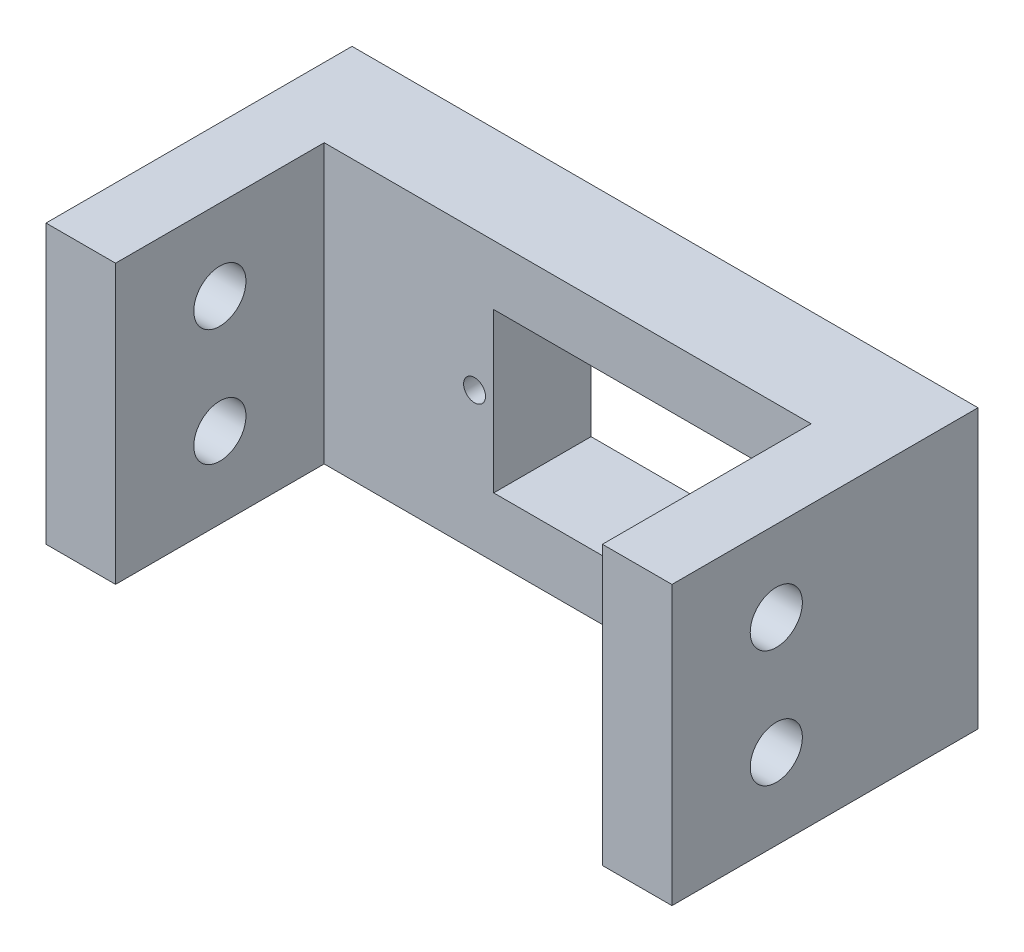
ISO-10303-21;
HEADER;
FILE_DESCRIPTION(('STEP AP214'),'2;1');
FILE_NAME('part.step','',(''),(''),'','','');
FILE_SCHEMA(('AUTOMOTIVE_DESIGN { 1 0 10303 214 1 1 1 1 }'));
ENDSEC;
DATA;
#1=APPLICATION_CONTEXT('core data for automotive mechanical design processes');
#2=APPLICATION_PROTOCOL_DEFINITION('international standard','automotive_design',2000,#1);
#3=PRODUCT_CONTEXT('',#1,'mechanical');
#4=PRODUCT('Part','Part','',(#3));
#5=PRODUCT_RELATED_PRODUCT_CATEGORY('part','',(#4));
#6=PRODUCT_DEFINITION_FORMATION('','',#4);
#7=PRODUCT_DEFINITION_CONTEXT('part definition',#1,'design');
#8=PRODUCT_DEFINITION('design','',#6,#7);
#9=PRODUCT_DEFINITION_SHAPE('','',#8);
#10=(LENGTH_UNIT() NAMED_UNIT(*) SI_UNIT(.MILLI.,.METRE.));
#11=(NAMED_UNIT(*) PLANE_ANGLE_UNIT() SI_UNIT($,.RADIAN.));
#12=(NAMED_UNIT(*) SI_UNIT($,.STERADIAN.) SOLID_ANGLE_UNIT());
#13=UNCERTAINTY_MEASURE_WITH_UNIT(LENGTH_MEASURE(1.E-05),#10,'distance_accuracy_value','');
#14=(GEOMETRIC_REPRESENTATION_CONTEXT(3) GLOBAL_UNCERTAINTY_ASSIGNED_CONTEXT((#13)) GLOBAL_UNIT_ASSIGNED_CONTEXT((#10,
#11,#12)) REPRESENTATION_CONTEXT('',''));
#15=CARTESIAN_POINT('',(0.,0.,0.));
#16=DIRECTION('',(0.,0.,1.));
#17=DIRECTION('',(1.,0.,0.));
#18=AXIS2_PLACEMENT_3D('',#15,#16,#17);
#19=CARTESIAN_POINT('',(28.575,25.4,-8.88999999999999));
#20=DIRECTION('',(-1.,0.,0.));
#21=DIRECTION('',(0.,0.,1.));
#22=AXIS2_PLACEMENT_3D('',#19,#20,#21);
#23=PLANE('',#22);
#24=CARTESIAN_POINT('',(28.575,18.034,9.525));
#25=DIRECTION('',(-1.,0.,0.));
#26=DIRECTION('',(0.,0.,1.));
#27=AXIS2_PLACEMENT_3D('',#24,#25,#26);
#28=CIRCLE('',#27,2.38125000000001);
#29=CARTESIAN_POINT('',(28.575,18.034,11.90625));
#30=VERTEX_POINT('',#29);
#31=EDGE_CURVE('E155',#30,#30,#28,.T.);
#32=ORIENTED_EDGE('',*,*,#31,.T.);
#33=EDGE_LOOP('',(#32));
#34=FACE_BOUND('',#33,.T.);
#35=CARTESIAN_POINT('',(28.575,7.366,9.525));
#36=DIRECTION('',(-1.,0.,0.));
#37=DIRECTION('',(0.,0.,-1.));
#38=AXIS2_PLACEMENT_3D('',#35,#36,#37);
#39=CIRCLE('',#38,2.38125);
#40=CARTESIAN_POINT('',(28.575,7.366,7.14375));
#41=VERTEX_POINT('',#40);
#42=EDGE_CURVE('E156',#41,#41,#39,.T.);
#43=ORIENTED_EDGE('',*,*,#42,.T.);
#44=EDGE_LOOP('',(#43));
#45=FACE_BOUND('',#44,.T.);
#46=DIRECTION('',(0.,0.,-1.));
#47=VECTOR('',#46,1.);
#48=CARTESIAN_POINT('',(28.575,0.,-8.88999999999999));
#49=LINE('',#48,#47);
#50=CARTESIAN_POINT('',(28.575,0.,19.05));
#51=VERTEX_POINT('',#50);
#52=CARTESIAN_POINT('',(28.575,0.,-8.88999999999999));
#53=VERTEX_POINT('',#52);
#54=EDGE_CURVE('E172',#51,#53,#49,.T.);
#55=ORIENTED_EDGE('',*,*,#54,.T.);
#56=DIRECTION('',(0.,-1.,0.));
#57=VECTOR('',#56,1.);
#58=CARTESIAN_POINT('',(28.575,25.4,-8.88999999999999));
#59=LINE('',#58,#57);
#60=CARTESIAN_POINT('',(28.575,25.4,-8.88999999999999));
#61=VERTEX_POINT('',#60);
#62=EDGE_CURVE('E227',#61,#53,#59,.T.);
#63=ORIENTED_EDGE('',*,*,#62,.F.);
#64=DIRECTION('',(0.,0.,-1.));
#65=VECTOR('',#64,1.);
#66=CARTESIAN_POINT('',(28.575,25.4,-8.88999999999999));
#67=LINE('',#66,#65);
#68=CARTESIAN_POINT('',(28.575,25.4,19.05));
#69=VERTEX_POINT('',#68);
#70=EDGE_CURVE('E173',#69,#61,#67,.T.);
#71=ORIENTED_EDGE('',*,*,#70,.F.);
#72=DIRECTION('',(0.,-1.,0.));
#73=VECTOR('',#72,1.);
#74=CARTESIAN_POINT('',(28.575,25.4,19.05));
#75=LINE('',#74,#73);
#76=EDGE_CURVE('E191',#69,#51,#75,.T.);
#77=ORIENTED_EDGE('',*,*,#76,.T.);
#78=EDGE_LOOP('',(#55,#63,#71,#77));
#79=FACE_BOUND('',#78,.T.);
#80=ADVANCED_FACE('F33',(#34,#45,#79),#23,.F.);
#81=CARTESIAN_POINT('',(-28.575,25.4,-8.88999999999999));
#82=DIRECTION('',(0.,0.,1.));
#83=DIRECTION('',(1.,0.,0.));
#84=AXIS2_PLACEMENT_3D('',#81,#82,#83);
#85=PLANE('',#84);
#86=CARTESIAN_POINT('',(-8.5,12.7,-8.88999999999999));
#87=DIRECTION('',(0.,0.,-1.));
#88=DIRECTION('',(-1.,0.,0.));
#89=AXIS2_PLACEMENT_3D('',#86,#87,#88);
#90=CIRCLE('',#89,1.);
#91=CARTESIAN_POINT('',(-9.50000000000001,12.7,-8.88999999999999));
#92=VERTEX_POINT('',#91);
#93=EDGE_CURVE('E240',#92,#92,#90,.T.);
#94=ORIENTED_EDGE('',*,*,#93,.F.);
#95=EDGE_LOOP('',(#94));
#96=FACE_BOUND('',#95,.T.);
#97=CARTESIAN_POINT('',(19.,12.7,-8.88999999999999));
#98=DIRECTION('',(0.,0.,-1.));
#99=DIRECTION('',(-1.,0.,0.));
#100=AXIS2_PLACEMENT_3D('',#97,#98,#99);
#101=CIRCLE('',#100,1.);
#102=CARTESIAN_POINT('',(18.,12.7,-8.88999999999999));
#103=VERTEX_POINT('',#102);
#104=EDGE_CURVE('E149',#103,#103,#101,.T.);
#105=ORIENTED_EDGE('',*,*,#104,.F.);
#106=EDGE_LOOP('',(#105));
#107=FACE_BOUND('',#106,.T.);
#108=DIRECTION('',(-1.,0.,0.));
#109=VECTOR('',#108,1.);
#110=CARTESIAN_POINT('',(17.25,5.45,-8.88999999999999));
#111=LINE('',#110,#109);
#112=CARTESIAN_POINT('',(17.25,5.45,-8.88999999999999));
#113=VERTEX_POINT('',#112);
#114=CARTESIAN_POINT('',(-6.75,5.45,-8.88999999999999));
#115=VERTEX_POINT('',#114);
#116=EDGE_CURVE('E135',#113,#115,#111,.T.);
#117=ORIENTED_EDGE('',*,*,#116,.F.);
#118=DIRECTION('',(0.,-1.,0.));
#119=VECTOR('',#118,1.);
#120=CARTESIAN_POINT('',(17.25,19.95,-8.88999999999999));
#121=LINE('',#120,#119);
#122=CARTESIAN_POINT('',(17.25,19.95,-8.88999999999999));
#123=VERTEX_POINT('',#122);
#124=EDGE_CURVE('E49',#123,#113,#121,.T.);
#125=ORIENTED_EDGE('',*,*,#124,.F.);
#126=DIRECTION('',(1.,0.,0.));
#127=VECTOR('',#126,1.);
#128=CARTESIAN_POINT('',(17.25,19.95,-8.88999999999999));
#129=LINE('',#128,#127);
#130=CARTESIAN_POINT('',(-6.75,19.95,-8.88999999999999));
#131=VERTEX_POINT('',#130);
#132=EDGE_CURVE('E142',#131,#123,#129,.T.);
#133=ORIENTED_EDGE('',*,*,#132,.F.);
#134=DIRECTION('',(0.,1.,0.));
#135=VECTOR('',#134,1.);
#136=CARTESIAN_POINT('',(-6.75,19.95,-8.88999999999999));
#137=LINE('',#136,#135);
#138=EDGE_CURVE('E126',#115,#131,#137,.T.);
#139=ORIENTED_EDGE('',*,*,#138,.F.);
#140=EDGE_LOOP('',(#117,#125,#133,#139));
#141=FACE_BOUND('',#140,.T.);
#142=DIRECTION('',(-1.,0.,0.));
#143=VECTOR('',#142,1.);
#144=CARTESIAN_POINT('',(-28.575,0.,-8.88999999999999));
#145=LINE('',#144,#143);
#146=CARTESIAN_POINT('',(-28.575,0.,-8.88999999999999));
#147=VERTEX_POINT('',#146);
#148=EDGE_CURVE('E194',#53,#147,#145,.T.);
#149=ORIENTED_EDGE('',*,*,#148,.T.);
#150=DIRECTION('',(0.,-1.,0.));
#151=VECTOR('',#150,1.);
#152=CARTESIAN_POINT('',(-28.575,25.4,-8.88999999999999));
#153=LINE('',#152,#151);
#154=CARTESIAN_POINT('',(-28.575,25.4,-8.88999999999999));
#155=VERTEX_POINT('',#154);
#156=EDGE_CURVE('E224',#155,#147,#153,.T.);
#157=ORIENTED_EDGE('',*,*,#156,.F.);
#158=DIRECTION('',(-1.,0.,0.));
#159=VECTOR('',#158,1.);
#160=CARTESIAN_POINT('',(-28.575,25.4,-8.88999999999999));
#161=LINE('',#160,#159);
#162=EDGE_CURVE('E176',#61,#155,#161,.T.);
#163=ORIENTED_EDGE('',*,*,#162,.F.);
#164=ORIENTED_EDGE('',*,*,#62,.T.);
#165=EDGE_LOOP('',(#149,#157,#163,#164));
#166=FACE_BOUND('',#165,.T.);
#167=ADVANCED_FACE('F139',(#96,#107,#141,#166),#85,.F.);
#168=CARTESIAN_POINT('',(-28.575,25.4,-8.88999999999999));
#169=DIRECTION('',(1.,0.,0.));
#170=DIRECTION('',(0.,0.,-1.));
#171=AXIS2_PLACEMENT_3D('',#168,#169,#170);
#172=PLANE('',#171);
#173=CARTESIAN_POINT('',(-28.575,18.034,9.525));
#174=DIRECTION('',(-1.,0.,0.));
#175=DIRECTION('',(0.,0.,1.));
#176=AXIS2_PLACEMENT_3D('',#173,#174,#175);
#177=CIRCLE('',#176,2.38125000000001);
#178=CARTESIAN_POINT('',(-28.575,18.034,11.90625));
#179=VERTEX_POINT('',#178);
#180=EDGE_CURVE('E152',#179,#179,#177,.T.);
#181=ORIENTED_EDGE('',*,*,#180,.F.);
#182=EDGE_LOOP('',(#181));
#183=FACE_BOUND('',#182,.T.);
#184=CARTESIAN_POINT('',(-28.575,7.366,9.525));
#185=DIRECTION('',(-1.,0.,0.));
#186=DIRECTION('',(0.,0.,-1.));
#187=AXIS2_PLACEMENT_3D('',#184,#185,#186);
#188=CIRCLE('',#187,2.38125);
#189=CARTESIAN_POINT('',(-28.575,7.366,7.14375));
#190=VERTEX_POINT('',#189);
#191=EDGE_CURVE('E160',#190,#190,#188,.T.);
#192=ORIENTED_EDGE('',*,*,#191,.F.);
#193=EDGE_LOOP('',(#192));
#194=FACE_BOUND('',#193,.T.);
#195=DIRECTION('',(0.,0.,1.));
#196=VECTOR('',#195,1.);
#197=CARTESIAN_POINT('',(-28.575,0.,-8.88999999999999));
#198=LINE('',#197,#196);
#199=CARTESIAN_POINT('',(-28.575,0.,19.05));
#200=VERTEX_POINT('',#199);
#201=EDGE_CURVE('E196',#147,#200,#198,.T.);
#202=ORIENTED_EDGE('',*,*,#201,.T.);
#203=DIRECTION('',(0.,-1.,0.));
#204=VECTOR('',#203,1.);
#205=CARTESIAN_POINT('',(-28.575,25.4,19.05));
#206=LINE('',#205,#204);
#207=CARTESIAN_POINT('',(-28.575,25.4,19.05));
#208=VERTEX_POINT('',#207);
#209=EDGE_CURVE('E221',#208,#200,#206,.T.);
#210=ORIENTED_EDGE('',*,*,#209,.F.);
#211=DIRECTION('',(0.,0.,1.));
#212=VECTOR('',#211,1.);
#213=CARTESIAN_POINT('',(-28.575,25.4,-8.88999999999999));
#214=LINE('',#213,#212);
#215=EDGE_CURVE('E179',#155,#208,#214,.T.);
#216=ORIENTED_EDGE('',*,*,#215,.F.);
#217=ORIENTED_EDGE('',*,*,#156,.T.);
#218=EDGE_LOOP('',(#202,#210,#216,#217));
#219=FACE_BOUND('',#218,.T.);
#220=ADVANCED_FACE('F256',(#183,#194,#219),#172,.F.);
#221=CARTESIAN_POINT('',(-28.575,25.4,19.05));
#222=DIRECTION('',(0.,0.,-1.));
#223=DIRECTION('',(-1.,0.,0.));
#224=AXIS2_PLACEMENT_3D('',#221,#222,#223);
#225=PLANE('',#224);
#226=DIRECTION('',(1.,0.,0.));
#227=VECTOR('',#226,1.);
#228=CARTESIAN_POINT('',(-28.575,0.,19.05));
#229=LINE('',#228,#227);
#230=CARTESIAN_POINT('',(-22.225,0.,19.05));
#231=VERTEX_POINT('',#230);
#232=EDGE_CURVE('E198',#200,#231,#229,.T.);
#233=ORIENTED_EDGE('',*,*,#232,.T.);
#234=DIRECTION('',(0.,-1.,0.));
#235=VECTOR('',#234,1.);
#236=CARTESIAN_POINT('',(-22.225,25.4,19.05));
#237=LINE('',#236,#235);
#238=CARTESIAN_POINT('',(-22.225,25.4,19.05));
#239=VERTEX_POINT('',#238);
#240=EDGE_CURVE('E218',#239,#231,#237,.T.);
#241=ORIENTED_EDGE('',*,*,#240,.F.);
#242=DIRECTION('',(1.,0.,0.));
#243=VECTOR('',#242,1.);
#244=CARTESIAN_POINT('',(-28.575,25.4,19.05));
#245=LINE('',#244,#243);
#246=EDGE_CURVE('E181',#208,#239,#245,.T.);
#247=ORIENTED_EDGE('',*,*,#246,.F.);
#248=ORIENTED_EDGE('',*,*,#209,.T.);
#249=EDGE_LOOP('',(#233,#241,#247,#248));
#250=FACE_BOUND('',#249,.T.);
#251=ADVANCED_FACE('F262',(#250),#225,.F.);
#252=CARTESIAN_POINT('',(-22.225,25.4,19.05));
#253=DIRECTION('',(-1.,0.,0.));
#254=DIRECTION('',(0.,0.,1.));
#255=AXIS2_PLACEMENT_3D('',#252,#253,#254);
#256=PLANE('',#255);
#257=CARTESIAN_POINT('',(-22.225,18.034,9.525));
#258=DIRECTION('',(-1.,0.,0.));
#259=DIRECTION('',(0.,0.,1.));
#260=AXIS2_PLACEMENT_3D('',#257,#258,#259);
#261=CIRCLE('',#260,2.38125000000001);
#262=CARTESIAN_POINT('',(-22.225,18.034,11.90625));
#263=VERTEX_POINT('',#262);
#264=EDGE_CURVE('E169',#263,#263,#261,.T.);
#265=ORIENTED_EDGE('',*,*,#264,.T.);
#266=EDGE_LOOP('',(#265));
#267=FACE_BOUND('',#266,.T.);
#268=CARTESIAN_POINT('',(-22.225,7.366,9.525));
#269=DIRECTION('',(-1.,0.,0.));
#270=DIRECTION('',(0.,0.,1.));
#271=AXIS2_PLACEMENT_3D('',#268,#269,#270);
#272=CIRCLE('',#271,2.38125);
#273=CARTESIAN_POINT('',(-22.225,7.366,11.90625));
#274=VERTEX_POINT('',#273);
#275=EDGE_CURVE('E165',#274,#274,#272,.T.);
#276=ORIENTED_EDGE('',*,*,#275,.T.);
#277=EDGE_LOOP('',(#276));
#278=FACE_BOUND('',#277,.T.);
#279=DIRECTION('',(0.,0.,-1.));
#280=VECTOR('',#279,1.);
#281=CARTESIAN_POINT('',(-22.225,0.,19.05));
#282=LINE('',#281,#280);
#283=CARTESIAN_POINT('',(-22.225,0.,0.));
#284=VERTEX_POINT('',#283);
#285=EDGE_CURVE('E200',#231,#284,#282,.T.);
#286=ORIENTED_EDGE('',*,*,#285,.T.);
#287=DIRECTION('',(0.,-1.,0.));
#288=VECTOR('',#287,1.);
#289=CARTESIAN_POINT('',(-22.225,25.4,0.));
#290=LINE('',#289,#288);
#291=CARTESIAN_POINT('',(-22.225,25.4,0.));
#292=VERTEX_POINT('',#291);
#293=EDGE_CURVE('E215',#292,#284,#290,.T.);
#294=ORIENTED_EDGE('',*,*,#293,.F.);
#295=DIRECTION('',(0.,0.,-1.));
#296=VECTOR('',#295,1.);
#297=CARTESIAN_POINT('',(-22.225,25.4,19.05));
#298=LINE('',#297,#296);
#299=EDGE_CURVE('E183',#239,#292,#298,.T.);
#300=ORIENTED_EDGE('',*,*,#299,.F.);
#301=ORIENTED_EDGE('',*,*,#240,.T.);
#302=EDGE_LOOP('',(#286,#294,#300,#301));
#303=FACE_BOUND('',#302,.T.);
#304=ADVANCED_FACE('F269',(#267,#278,#303),#256,.F.);
#305=CARTESIAN_POINT('',(22.225,25.4,0.));
#306=DIRECTION('',(0.,0.,-1.));
#307=DIRECTION('',(-1.,0.,0.));
#308=AXIS2_PLACEMENT_3D('',#305,#306,#307);
#309=PLANE('',#308);
#310=CARTESIAN_POINT('',(-8.5,12.7,0.));
#311=DIRECTION('',(0.,0.,-1.));
#312=DIRECTION('',(-1.,0.,0.));
#313=AXIS2_PLACEMENT_3D('',#310,#311,#312);
#314=CIRCLE('',#313,1.);
#315=CARTESIAN_POINT('',(-9.50000000000001,12.7,0.));
#316=VERTEX_POINT('',#315);
#317=EDGE_CURVE('E36',#316,#316,#314,.T.);
#318=ORIENTED_EDGE('',*,*,#317,.T.);
#319=EDGE_LOOP('',(#318));
#320=FACE_BOUND('',#319,.T.);
#321=CARTESIAN_POINT('',(19.,12.7,0.));
#322=DIRECTION('',(0.,0.,-1.));
#323=DIRECTION('',(-1.,0.,0.));
#324=AXIS2_PLACEMENT_3D('',#321,#322,#323);
#325=CIRCLE('',#324,1.);
#326=CARTESIAN_POINT('',(18.,12.7,0.));
#327=VERTEX_POINT('',#326);
#328=EDGE_CURVE('E238',#327,#327,#325,.T.);
#329=ORIENTED_EDGE('',*,*,#328,.T.);
#330=EDGE_LOOP('',(#329));
#331=FACE_BOUND('',#330,.T.);
#332=DIRECTION('',(1.,0.,0.));
#333=VECTOR('',#332,1.);
#334=CARTESIAN_POINT('',(22.225,19.95,0.));
#335=LINE('',#334,#333);
#336=CARTESIAN_POINT('',(-6.75,19.95,0.));
#337=VERTEX_POINT('',#336);
#338=CARTESIAN_POINT('',(17.25,19.95,0.));
#339=VERTEX_POINT('',#338);
#340=EDGE_CURVE('E41',#337,#339,#335,.T.);
#341=ORIENTED_EDGE('',*,*,#340,.T.);
#342=DIRECTION('',(0.,-1.,0.));
#343=VECTOR('',#342,1.);
#344=CARTESIAN_POINT('',(17.25,25.4,0.));
#345=LINE('',#344,#343);
#346=CARTESIAN_POINT('',(17.25,5.45,0.));
#347=VERTEX_POINT('',#346);
#348=EDGE_CURVE('E11',#339,#347,#345,.T.);
#349=ORIENTED_EDGE('',*,*,#348,.T.);
#350=DIRECTION('',(-1.,0.,0.));
#351=VECTOR('',#350,1.);
#352=CARTESIAN_POINT('',(22.225,5.45,0.));
#353=LINE('',#352,#351);
#354=CARTESIAN_POINT('',(-6.75,5.45,0.));
#355=VERTEX_POINT('',#354);
#356=EDGE_CURVE('E230',#347,#355,#353,.T.);
#357=ORIENTED_EDGE('',*,*,#356,.T.);
#358=DIRECTION('',(0.,1.,0.));
#359=VECTOR('',#358,1.);
#360=CARTESIAN_POINT('',(-6.75,25.4,0.));
#361=LINE('',#360,#359);
#362=EDGE_CURVE('E129',#355,#337,#361,.T.);
#363=ORIENTED_EDGE('',*,*,#362,.T.);
#364=EDGE_LOOP('',(#341,#349,#357,#363));
#365=FACE_BOUND('',#364,.T.);
#366=DIRECTION('',(1.,0.,0.));
#367=VECTOR('',#366,1.);
#368=CARTESIAN_POINT('',(22.225,0.,0.));
#369=LINE('',#368,#367);
#370=CARTESIAN_POINT('',(22.225,0.,0.));
#371=VERTEX_POINT('',#370);
#372=EDGE_CURVE('E202',#284,#371,#369,.T.);
#373=ORIENTED_EDGE('',*,*,#372,.T.);
#374=DIRECTION('',(0.,-1.,0.));
#375=VECTOR('',#374,1.);
#376=CARTESIAN_POINT('',(22.225,25.4,0.));
#377=LINE('',#376,#375);
#378=CARTESIAN_POINT('',(22.225,25.4,0.));
#379=VERTEX_POINT('',#378);
#380=EDGE_CURVE('E212',#379,#371,#377,.T.);
#381=ORIENTED_EDGE('',*,*,#380,.F.);
#382=DIRECTION('',(1.,0.,0.));
#383=VECTOR('',#382,1.);
#384=CARTESIAN_POINT('',(22.225,25.4,0.));
#385=LINE('',#384,#383);
#386=EDGE_CURVE('E185',#292,#379,#385,.T.);
#387=ORIENTED_EDGE('',*,*,#386,.F.);
#388=ORIENTED_EDGE('',*,*,#293,.T.);
#389=EDGE_LOOP('',(#373,#381,#387,#388));
#390=FACE_BOUND('',#389,.T.);
#391=ADVANCED_FACE('F273',(#320,#331,#365,#390),#309,.F.);
#392=CARTESIAN_POINT('',(22.225,25.4,19.05));
#393=DIRECTION('',(1.,0.,0.));
#394=DIRECTION('',(0.,0.,-1.));
#395=AXIS2_PLACEMENT_3D('',#392,#393,#394);
#396=PLANE('',#395);
#397=CARTESIAN_POINT('',(22.225,18.034,9.525));
#398=DIRECTION('',(1.,0.,0.));
#399=DIRECTION('',(0.,0.,-1.));
#400=AXIS2_PLACEMENT_3D('',#397,#398,#399);
#401=CIRCLE('',#400,2.38125000000001);
#402=CARTESIAN_POINT('',(22.225,18.034,7.14375));
#403=VERTEX_POINT('',#402);
#404=EDGE_CURVE('E168',#403,#403,#401,.T.);
#405=ORIENTED_EDGE('',*,*,#404,.T.);
#406=EDGE_LOOP('',(#405));
#407=FACE_BOUND('',#406,.T.);
#408=CARTESIAN_POINT('',(22.225,7.366,9.525));
#409=DIRECTION('',(1.,0.,0.));
#410=DIRECTION('',(0.,0.,-1.));
#411=AXIS2_PLACEMENT_3D('',#408,#409,#410);
#412=CIRCLE('',#411,2.38125);
#413=CARTESIAN_POINT('',(22.225,7.366,7.14375));
#414=VERTEX_POINT('',#413);
#415=EDGE_CURVE('E159',#414,#414,#412,.T.);
#416=ORIENTED_EDGE('',*,*,#415,.T.);
#417=EDGE_LOOP('',(#416));
#418=FACE_BOUND('',#417,.T.);
#419=DIRECTION('',(0.,0.,1.));
#420=VECTOR('',#419,1.);
#421=CARTESIAN_POINT('',(22.225,0.,19.05));
#422=LINE('',#421,#420);
#423=CARTESIAN_POINT('',(22.225,0.,19.05));
#424=VERTEX_POINT('',#423);
#425=EDGE_CURVE('E204',#371,#424,#422,.T.);
#426=ORIENTED_EDGE('',*,*,#425,.T.);
#427=DIRECTION('',(0.,-1.,0.));
#428=VECTOR('',#427,1.);
#429=CARTESIAN_POINT('',(22.225,25.4,19.05));
#430=LINE('',#429,#428);
#431=CARTESIAN_POINT('',(22.225,25.4,19.05));
#432=VERTEX_POINT('',#431);
#433=EDGE_CURVE('E209',#432,#424,#430,.T.);
#434=ORIENTED_EDGE('',*,*,#433,.F.);
#435=DIRECTION('',(0.,0.,1.));
#436=VECTOR('',#435,1.);
#437=CARTESIAN_POINT('',(22.225,25.4,19.05));
#438=LINE('',#437,#436);
#439=EDGE_CURVE('E187',#379,#432,#438,.T.);
#440=ORIENTED_EDGE('',*,*,#439,.F.);
#441=ORIENTED_EDGE('',*,*,#380,.T.);
#442=EDGE_LOOP('',(#426,#434,#440,#441));
#443=FACE_BOUND('',#442,.T.);
#444=ADVANCED_FACE('F277',(#407,#418,#443),#396,.F.);
#445=CARTESIAN_POINT('',(28.575,25.4,19.05));
#446=DIRECTION('',(0.,0.,-1.));
#447=DIRECTION('',(-1.,0.,0.));
#448=AXIS2_PLACEMENT_3D('',#445,#446,#447);
#449=PLANE('',#448);
#450=DIRECTION('',(1.,0.,0.));
#451=VECTOR('',#450,1.);
#452=CARTESIAN_POINT('',(28.575,0.,19.05));
#453=LINE('',#452,#451);
#454=EDGE_CURVE('E177',#424,#51,#453,.T.);
#455=ORIENTED_EDGE('',*,*,#454,.T.);
#456=ORIENTED_EDGE('',*,*,#76,.F.);
#457=DIRECTION('',(1.,0.,0.));
#458=VECTOR('',#457,1.);
#459=CARTESIAN_POINT('',(28.575,25.4,19.05));
#460=LINE('',#459,#458);
#461=EDGE_CURVE('E189',#432,#69,#460,.T.);
#462=ORIENTED_EDGE('',*,*,#461,.F.);
#463=ORIENTED_EDGE('',*,*,#433,.T.);
#464=EDGE_LOOP('',(#455,#456,#462,#463));
#465=FACE_BOUND('',#464,.T.);
#466=ADVANCED_FACE('F281',(#465),#449,.F.);
#467=CARTESIAN_POINT('',(0.,25.4,0.));
#468=DIRECTION('',(0.,-1.,0.));
#469=DIRECTION('',(0.,0.,-1.));
#470=AXIS2_PLACEMENT_3D('',#467,#468,#469);
#471=PLANE('',#470);
#472=ORIENTED_EDGE('',*,*,#70,.T.);
#473=ORIENTED_EDGE('',*,*,#162,.T.);
#474=ORIENTED_EDGE('',*,*,#215,.T.);
#475=ORIENTED_EDGE('',*,*,#246,.T.);
#476=ORIENTED_EDGE('',*,*,#299,.T.);
#477=ORIENTED_EDGE('',*,*,#386,.T.);
#478=ORIENTED_EDGE('',*,*,#439,.T.);
#479=ORIENTED_EDGE('',*,*,#461,.T.);
#480=EDGE_LOOP('',(#472,#473,#474,#475,#476,#477,#478,#479));
#481=FACE_BOUND('',#480,.T.);
#482=ADVANCED_FACE('F285',(#481),#471,.F.);
#483=CARTESIAN_POINT('',(0.,0.,0.));
#484=DIRECTION('',(0.,-1.,0.));
#485=DIRECTION('',(0.,0.,-1.));
#486=AXIS2_PLACEMENT_3D('',#483,#484,#485);
#487=PLANE('',#486);
#488=ORIENTED_EDGE('',*,*,#54,.F.);
#489=ORIENTED_EDGE('',*,*,#454,.F.);
#490=ORIENTED_EDGE('',*,*,#425,.F.);
#491=ORIENTED_EDGE('',*,*,#372,.F.);
#492=ORIENTED_EDGE('',*,*,#285,.F.);
#493=ORIENTED_EDGE('',*,*,#232,.F.);
#494=ORIENTED_EDGE('',*,*,#201,.F.);
#495=ORIENTED_EDGE('',*,*,#148,.F.);
#496=EDGE_LOOP('',(#488,#489,#490,#491,#492,#493,#494,#495));
#497=FACE_BOUND('',#496,.T.);
#498=ADVANCED_FACE('F287',(#497),#487,.T.);
#499=CARTESIAN_POINT('',(28.575,7.366,9.525));
#500=DIRECTION('',(-1.,0.,0.));
#501=DIRECTION('',(0.,0.,1.));
#502=AXIS2_PLACEMENT_3D('',#499,#500,#501);
#503=CYLINDRICAL_SURFACE('',#502,2.38125);
#504=ORIENTED_EDGE('',*,*,#42,.F.);
#505=EDGE_LOOP('',(#504));
#506=FACE_BOUND('',#505,.T.);
#507=ORIENTED_EDGE('',*,*,#415,.F.);
#508=EDGE_LOOP('',(#507));
#509=FACE_BOUND('',#508,.T.);
#510=ADVANCED_FACE('F290',(#506,#509),#503,.F.);
#511=CARTESIAN_POINT('',(28.575,18.034,9.525));
#512=DIRECTION('',(-1.,0.,0.));
#513=DIRECTION('',(0.,0.,1.));
#514=AXIS2_PLACEMENT_3D('',#511,#512,#513);
#515=CYLINDRICAL_SURFACE('',#514,2.38125000000001);
#516=ORIENTED_EDGE('',*,*,#31,.F.);
#517=EDGE_LOOP('',(#516));
#518=FACE_BOUND('',#517,.T.);
#519=ORIENTED_EDGE('',*,*,#404,.F.);
#520=EDGE_LOOP('',(#519));
#521=FACE_BOUND('',#520,.T.);
#522=ADVANCED_FACE('F299',(#518,#521),#515,.F.);
#523=ORIENTED_EDGE('',*,*,#191,.T.);
#524=EDGE_LOOP('',(#523));
#525=FACE_BOUND('',#524,.T.);
#526=ORIENTED_EDGE('',*,*,#275,.F.);
#527=EDGE_LOOP('',(#526));
#528=FACE_BOUND('',#527,.T.);
#529=ADVANCED_FACE('F295',(#525,#528),#503,.F.);
#530=ORIENTED_EDGE('',*,*,#180,.T.);
#531=EDGE_LOOP('',(#530));
#532=FACE_BOUND('',#531,.T.);
#533=ORIENTED_EDGE('',*,*,#264,.F.);
#534=EDGE_LOOP('',(#533));
#535=FACE_BOUND('',#534,.T.);
#536=ADVANCED_FACE('F298',(#532,#535),#515,.F.);
#537=CARTESIAN_POINT('',(17.25,19.95,19.05));
#538=DIRECTION('',(1.,0.,0.));
#539=DIRECTION('',(0.,0.,-1.));
#540=AXIS2_PLACEMENT_3D('',#537,#538,#539);
#541=PLANE('',#540);
#542=DIRECTION('',(0.,0.,-1.));
#543=VECTOR('',#542,1.);
#544=CARTESIAN_POINT('',(17.25,19.95,19.05));
#545=LINE('',#544,#543);
#546=EDGE_CURVE('E147',#339,#123,#545,.T.);
#547=ORIENTED_EDGE('',*,*,#546,.T.);
#548=ORIENTED_EDGE('',*,*,#124,.T.);
#549=DIRECTION('',(0.,0.,-1.));
#550=VECTOR('',#549,1.);
#551=CARTESIAN_POINT('',(17.25,5.45,19.05));
#552=LINE('',#551,#550);
#553=EDGE_CURVE('E132',#347,#113,#552,.T.);
#554=ORIENTED_EDGE('',*,*,#553,.F.);
#555=ORIENTED_EDGE('',*,*,#348,.F.);
#556=EDGE_LOOP('',(#547,#548,#554,#555));
#557=FACE_BOUND('',#556,.T.);
#558=ADVANCED_FACE('F303',(#557),#541,.F.);
#559=CARTESIAN_POINT('',(17.25,19.95,19.05));
#560=DIRECTION('',(0.,1.,0.));
#561=DIRECTION('',(-1.,0.,0.));
#562=AXIS2_PLACEMENT_3D('',#559,#560,#561);
#563=PLANE('',#562);
#564=DIRECTION('',(0.,0.,-1.));
#565=VECTOR('',#564,1.);
#566=CARTESIAN_POINT('',(-6.75,19.95,19.05));
#567=LINE('',#566,#565);
#568=EDGE_CURVE('E131',#337,#131,#567,.T.);
#569=ORIENTED_EDGE('',*,*,#568,.T.);
#570=ORIENTED_EDGE('',*,*,#132,.T.);
#571=ORIENTED_EDGE('',*,*,#546,.F.);
#572=ORIENTED_EDGE('',*,*,#340,.F.);
#573=EDGE_LOOP('',(#569,#570,#571,#572));
#574=FACE_BOUND('',#573,.T.);
#575=ADVANCED_FACE('F307',(#574),#563,.F.);
#576=CARTESIAN_POINT('',(-6.75,19.95,19.05));
#577=DIRECTION('',(-1.,0.,0.));
#578=DIRECTION('',(0.,0.,1.));
#579=AXIS2_PLACEMENT_3D('',#576,#577,#578);
#580=PLANE('',#579);
#581=DIRECTION('',(0.,0.,-1.));
#582=VECTOR('',#581,1.);
#583=CARTESIAN_POINT('',(-6.75,5.45,19.05));
#584=LINE('',#583,#582);
#585=EDGE_CURVE('E57',#355,#115,#584,.T.);
#586=ORIENTED_EDGE('',*,*,#585,.T.);
#587=ORIENTED_EDGE('',*,*,#138,.T.);
#588=ORIENTED_EDGE('',*,*,#568,.F.);
#589=ORIENTED_EDGE('',*,*,#362,.F.);
#590=EDGE_LOOP('',(#586,#587,#588,#589));
#591=FACE_BOUND('',#590,.T.);
#592=ADVANCED_FACE('F123',(#591),#580,.F.);
#593=CARTESIAN_POINT('',(17.25,5.45,19.05));
#594=DIRECTION('',(0.,-1.,0.));
#595=DIRECTION('',(0.,0.,-1.));
#596=AXIS2_PLACEMENT_3D('',#593,#594,#595);
#597=PLANE('',#596);
#598=ORIENTED_EDGE('',*,*,#553,.T.);
#599=ORIENTED_EDGE('',*,*,#116,.T.);
#600=ORIENTED_EDGE('',*,*,#585,.F.);
#601=ORIENTED_EDGE('',*,*,#356,.F.);
#602=EDGE_LOOP('',(#598,#599,#600,#601));
#603=FACE_BOUND('',#602,.T.);
#604=ADVANCED_FACE('F136',(#603),#597,.F.);
#605=CARTESIAN_POINT('',(19.,12.7,19.05));
#606=DIRECTION('',(0.,0.,-1.));
#607=DIRECTION('',(-1.,0.,0.));
#608=AXIS2_PLACEMENT_3D('',#605,#606,#607);
#609=CYLINDRICAL_SURFACE('',#608,1.);
#610=ORIENTED_EDGE('',*,*,#104,.T.);
#611=EDGE_LOOP('',(#610));
#612=FACE_BOUND('',#611,.T.);
#613=ORIENTED_EDGE('',*,*,#328,.F.);
#614=EDGE_LOOP('',(#613));
#615=FACE_BOUND('',#614,.T.);
#616=ADVANCED_FACE('F252',(#612,#615),#609,.F.);
#617=CARTESIAN_POINT('',(-8.5,12.7,19.05));
#618=DIRECTION('',(0.,0.,-1.));
#619=DIRECTION('',(-1.,0.,0.));
#620=AXIS2_PLACEMENT_3D('',#617,#618,#619);
#621=CYLINDRICAL_SURFACE('',#620,1.);
#622=ORIENTED_EDGE('',*,*,#93,.T.);
#623=EDGE_LOOP('',(#622));
#624=FACE_BOUND('',#623,.T.);
#625=ORIENTED_EDGE('',*,*,#317,.F.);
#626=EDGE_LOOP('',(#625));
#627=FACE_BOUND('',#626,.T.);
#628=ADVANCED_FACE('F317',(#624,#627),#621,.F.);
#629=CLOSED_SHELL('',(#80,#167,#220,#251,#304,#391,#444,#466,#482,#498,#510,#522,#529,#536,#558,
#575,#592,#604,#616,#628));
#630=MANIFOLD_SOLID_BREP('B2',#629);
#631=ADVANCED_BREP_SHAPE_REPRESENTATION('',(#18,#630),#14);
#632=SHAPE_DEFINITION_REPRESENTATION(#9,#631);
ENDSEC;
END-ISO-10303-21;
